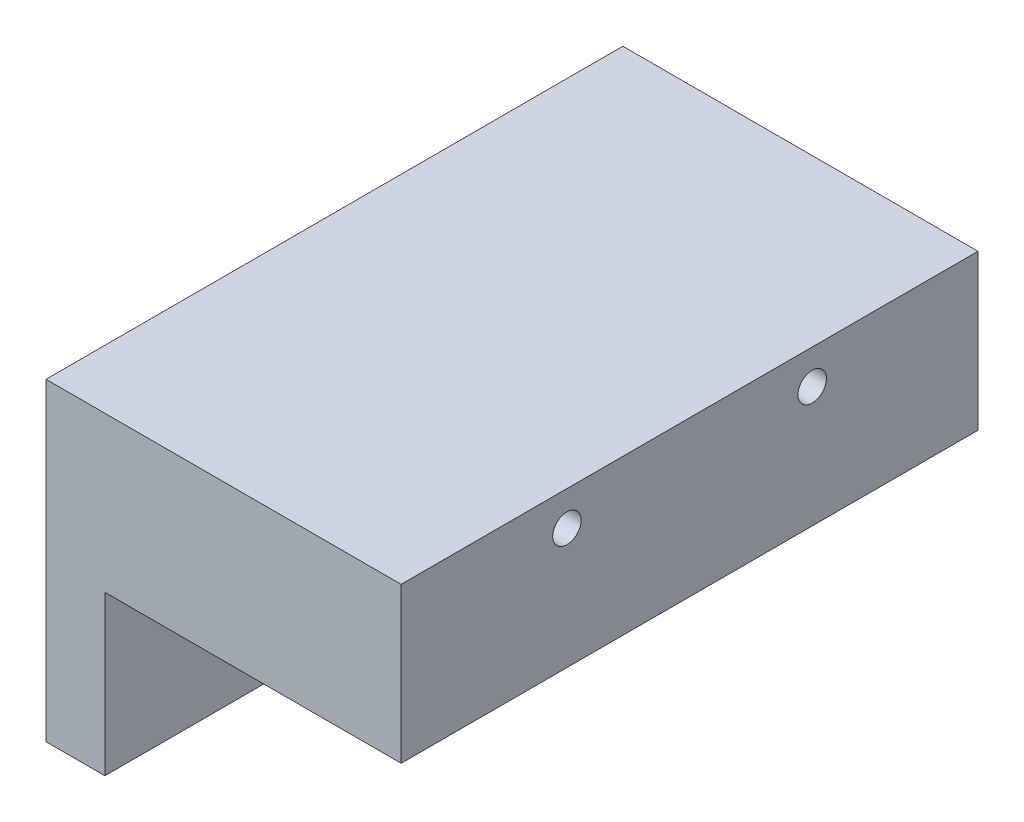
ISO-10303-21;
HEADER;
FILE_DESCRIPTION(('STEP AP214'),'2;1');
FILE_NAME('part.step','',(''),(''),'','','');
FILE_SCHEMA(('AUTOMOTIVE_DESIGN { 1 0 10303 214 1 1 1 1 }'));
ENDSEC;
DATA;
#1=APPLICATION_CONTEXT('core data for automotive mechanical design processes');
#2=APPLICATION_PROTOCOL_DEFINITION('international standard','automotive_design',2000,#1);
#3=PRODUCT_CONTEXT('',#1,'mechanical');
#4=PRODUCT('Part','Part','',(#3));
#5=PRODUCT_RELATED_PRODUCT_CATEGORY('part','',(#4));
#6=PRODUCT_DEFINITION_FORMATION('','',#4);
#7=PRODUCT_DEFINITION_CONTEXT('part definition',#1,'design');
#8=PRODUCT_DEFINITION('design','',#6,#7);
#9=PRODUCT_DEFINITION_SHAPE('','',#8);
#10=(LENGTH_UNIT() NAMED_UNIT(*) SI_UNIT(.MILLI.,.METRE.));
#11=(NAMED_UNIT(*) PLANE_ANGLE_UNIT() SI_UNIT($,.RADIAN.));
#12=(NAMED_UNIT(*) SI_UNIT($,.STERADIAN.) SOLID_ANGLE_UNIT());
#13=UNCERTAINTY_MEASURE_WITH_UNIT(LENGTH_MEASURE(1.E-05),#10,'distance_accuracy_value','');
#14=(GEOMETRIC_REPRESENTATION_CONTEXT(3) GLOBAL_UNCERTAINTY_ASSIGNED_CONTEXT((#13)) GLOBAL_UNIT_ASSIGNED_CONTEXT((#10,
#11,#12)) REPRESENTATION_CONTEXT('',''));
#15=CARTESIAN_POINT('',(0.,0.,0.));
#16=DIRECTION('',(0.,0.,1.));
#17=DIRECTION('',(1.,0.,0.));
#18=AXIS2_PLACEMENT_3D('',#15,#16,#17);
#19=CARTESIAN_POINT('',(-6.,0.,29.4));
#20=DIRECTION('',(0.,0.,-1.));
#21=DIRECTION('',(-1.,0.,0.));
#22=AXIS2_PLACEMENT_3D('',#19,#20,#21);
#23=PLANE('',#22);
#24=DIRECTION('',(0.,1.,0.));
#25=VECTOR('',#24,1.);
#26=CARTESIAN_POINT('',(0.,0.,29.4));
#27=LINE('',#26,#25);
#28=CARTESIAN_POINT('',(0.,-16.,29.4));
#29=VERTEX_POINT('',#28);
#30=CARTESIAN_POINT('',(0.,0.199999999999999,29.4));
#31=VERTEX_POINT('',#30);
#32=EDGE_CURVE('E142',#29,#31,#27,.T.);
#33=ORIENTED_EDGE('',*,*,#32,.T.);
#34=DIRECTION('',(-1.,0.,0.));
#35=VECTOR('',#34,1.);
#36=CARTESIAN_POINT('',(30.2,0.199999999999995,29.4));
#37=LINE('',#36,#35);
#38=CARTESIAN_POINT('',(30.2,0.199999999999995,29.4));
#39=VERTEX_POINT('',#38);
#40=EDGE_CURVE('E139',#39,#31,#37,.T.);
#41=ORIENTED_EDGE('',*,*,#40,.F.);
#42=DIRECTION('',(0.,1.,0.));
#43=VECTOR('',#42,1.);
#44=CARTESIAN_POINT('',(30.2,0.,29.4));
#45=LINE('',#44,#43);
#46=CARTESIAN_POINT('',(30.2,16.,29.4));
#47=VERTEX_POINT('',#46);
#48=EDGE_CURVE('E119',#39,#47,#45,.T.);
#49=ORIENTED_EDGE('',*,*,#48,.T.);
#50=DIRECTION('',(1.,0.,0.));
#51=VECTOR('',#50,1.);
#52=CARTESIAN_POINT('',(-6.,16.,29.4));
#53=LINE('',#52,#51);
#54=CARTESIAN_POINT('',(-6.,16.,29.4));
#55=VERTEX_POINT('',#54);
#56=EDGE_CURVE('E11',#55,#47,#53,.T.);
#57=ORIENTED_EDGE('',*,*,#56,.F.);
#58=DIRECTION('',(0.,1.,0.));
#59=VECTOR('',#58,1.);
#60=CARTESIAN_POINT('',(-6.,0.,29.4));
#61=LINE('',#60,#59);
#62=CARTESIAN_POINT('',(-6.,-16.,29.4));
#63=VERTEX_POINT('',#62);
#64=EDGE_CURVE('E66',#63,#55,#61,.T.);
#65=ORIENTED_EDGE('',*,*,#64,.F.);
#66=DIRECTION('',(1.,0.,0.));
#67=VECTOR('',#66,1.);
#68=CARTESIAN_POINT('',(-6.,-16.,29.4));
#69=LINE('',#68,#67);
#70=EDGE_CURVE('E44',#63,#29,#69,.T.);
#71=ORIENTED_EDGE('',*,*,#70,.T.);
#72=EDGE_LOOP('',(#33,#41,#49,#57,#65,#71));
#73=FACE_BOUND('',#72,.T.);
#74=ADVANCED_FACE('F41',(#73),#23,.F.);
#75=CARTESIAN_POINT('',(-6.,16.,0.));
#76=DIRECTION('',(0.,1.,0.));
#77=DIRECTION('',(0.,0.,1.));
#78=AXIS2_PLACEMENT_3D('',#75,#76,#77);
#79=PLANE('',#78);
#80=ORIENTED_EDGE('',*,*,#56,.T.);
#81=DIRECTION('',(0.,0.,1.));
#82=VECTOR('',#81,1.);
#83=CARTESIAN_POINT('',(30.2,16.,0.));
#84=LINE('',#83,#82);
#85=CARTESIAN_POINT('',(30.2,16.,-29.4));
#86=VERTEX_POINT('',#85);
#87=EDGE_CURVE('E114',#86,#47,#84,.T.);
#88=ORIENTED_EDGE('',*,*,#87,.F.);
#89=DIRECTION('',(1.,0.,0.));
#90=VECTOR('',#89,1.);
#91=CARTESIAN_POINT('',(-6.,16.,-29.4));
#92=LINE('',#91,#90);
#93=CARTESIAN_POINT('',(-6.,16.,-29.4));
#94=VERTEX_POINT('',#93);
#95=EDGE_CURVE('E49',#94,#86,#92,.T.);
#96=ORIENTED_EDGE('',*,*,#95,.F.);
#97=DIRECTION('',(0.,0.,1.));
#98=VECTOR('',#97,1.);
#99=CARTESIAN_POINT('',(-6.,16.,0.));
#100=LINE('',#99,#98);
#101=EDGE_CURVE('E147',#94,#55,#100,.T.);
#102=ORIENTED_EDGE('',*,*,#101,.T.);
#103=EDGE_LOOP('',(#80,#88,#96,#102));
#104=FACE_BOUND('',#103,.T.);
#105=ADVANCED_FACE('F115',(#104),#79,.T.);
#106=CARTESIAN_POINT('',(-6.,0.,-29.4));
#107=DIRECTION('',(0.,0.,-1.));
#108=DIRECTION('',(-1.,0.,0.));
#109=AXIS2_PLACEMENT_3D('',#106,#107,#108);
#110=PLANE('',#109);
#111=DIRECTION('',(0.,1.,0.));
#112=VECTOR('',#111,1.);
#113=CARTESIAN_POINT('',(0.,0.,-29.4));
#114=LINE('',#113,#112);
#115=CARTESIAN_POINT('',(0.,-16.,-29.4));
#116=VERTEX_POINT('',#115);
#117=CARTESIAN_POINT('',(0.,0.200000000000002,-29.4));
#118=VERTEX_POINT('',#117);
#119=EDGE_CURVE('E164',#116,#118,#114,.T.);
#120=ORIENTED_EDGE('',*,*,#119,.F.);
#121=DIRECTION('',(1.,0.,0.));
#122=VECTOR('',#121,1.);
#123=CARTESIAN_POINT('',(-6.,-16.,-29.4));
#124=LINE('',#123,#122);
#125=CARTESIAN_POINT('',(-6.,-16.,-29.4));
#126=VERTEX_POINT('',#125);
#127=EDGE_CURVE('E82',#126,#116,#124,.T.);
#128=ORIENTED_EDGE('',*,*,#127,.F.);
#129=DIRECTION('',(0.,1.,0.));
#130=VECTOR('',#129,1.);
#131=CARTESIAN_POINT('',(-6.,0.,-29.4));
#132=LINE('',#131,#130);
#133=EDGE_CURVE('E109',#126,#94,#132,.T.);
#134=ORIENTED_EDGE('',*,*,#133,.T.);
#135=ORIENTED_EDGE('',*,*,#95,.T.);
#136=DIRECTION('',(0.,1.,0.));
#137=VECTOR('',#136,1.);
#138=CARTESIAN_POINT('',(30.2,0.,-29.4));
#139=LINE('',#138,#137);
#140=CARTESIAN_POINT('',(30.2,0.200000000000002,-29.4));
#141=VERTEX_POINT('',#140);
#142=EDGE_CURVE('E108',#141,#86,#139,.T.);
#143=ORIENTED_EDGE('',*,*,#142,.F.);
#144=DIRECTION('',(-1.,0.,0.));
#145=VECTOR('',#144,1.);
#146=CARTESIAN_POINT('',(30.2,0.200000000000002,-29.4));
#147=LINE('',#146,#145);
#148=EDGE_CURVE('E136',#141,#118,#147,.T.);
#149=ORIENTED_EDGE('',*,*,#148,.T.);
#150=EDGE_LOOP('',(#120,#128,#134,#135,#143,#149));
#151=FACE_BOUND('',#150,.T.);
#152=ADVANCED_FACE('F105',(#151),#110,.T.);
#153=CARTESIAN_POINT('',(-6.,12.5,12.5));
#154=DIRECTION('',(1.,0.,0.));
#155=DIRECTION('',(0.,0.,-1.));
#156=AXIS2_PLACEMENT_3D('',#153,#154,#155);
#157=CYLINDRICAL_SURFACE('',#156,1.45);
#158=CARTESIAN_POINT('',(-6.,12.5,12.5));
#159=DIRECTION('',(1.,0.,0.));
#160=DIRECTION('',(0.,0.,-1.));
#161=AXIS2_PLACEMENT_3D('',#158,#159,#160);
#162=CIRCLE('',#161,1.45);
#163=CARTESIAN_POINT('',(-6.,12.5,11.05));
#164=VERTEX_POINT('',#163);
#165=EDGE_CURVE('E155',#164,#164,#162,.T.);
#166=ORIENTED_EDGE('',*,*,#165,.F.);
#167=EDGE_LOOP('',(#166));
#168=FACE_BOUND('',#167,.T.);
#169=CARTESIAN_POINT('',(30.2,12.5,12.5));
#170=DIRECTION('',(1.,0.,0.));
#171=DIRECTION('',(0.,0.,-1.));
#172=AXIS2_PLACEMENT_3D('',#169,#170,#171);
#173=CIRCLE('',#172,1.45);
#174=CARTESIAN_POINT('',(30.2,12.5,11.05));
#175=VERTEX_POINT('',#174);
#176=EDGE_CURVE('E131',#175,#175,#173,.T.);
#177=ORIENTED_EDGE('',*,*,#176,.T.);
#178=EDGE_LOOP('',(#177));
#179=FACE_BOUND('',#178,.T.);
#180=ADVANCED_FACE('F209',(#168,#179),#157,.F.);
#181=CARTESIAN_POINT('',(-6.,-12.5,-12.5));
#182=DIRECTION('',(1.,0.,0.));
#183=DIRECTION('',(0.,0.,-1.));
#184=AXIS2_PLACEMENT_3D('',#181,#182,#183);
#185=CYLINDRICAL_SURFACE('',#184,1.45);
#186=CARTESIAN_POINT('',(-6.,-12.5,-12.5));
#187=DIRECTION('',(1.,0.,0.));
#188=DIRECTION('',(0.,0.,-1.));
#189=AXIS2_PLACEMENT_3D('',#186,#187,#188);
#190=CIRCLE('',#189,1.45);
#191=CARTESIAN_POINT('',(-6.,-12.5,-13.95));
#192=VERTEX_POINT('',#191);
#193=EDGE_CURVE('E152',#192,#192,#190,.T.);
#194=ORIENTED_EDGE('',*,*,#193,.F.);
#195=EDGE_LOOP('',(#194));
#196=FACE_BOUND('',#195,.T.);
#197=CARTESIAN_POINT('',(0.,-12.5,-12.5));
#198=DIRECTION('',(1.,0.,0.));
#199=DIRECTION('',(0.,0.,-1.));
#200=AXIS2_PLACEMENT_3D('',#197,#198,#199);
#201=CIRCLE('',#200,1.45);
#202=CARTESIAN_POINT('',(0.,-12.5,-13.95));
#203=VERTEX_POINT('',#202);
#204=EDGE_CURVE('E144',#203,#203,#201,.T.);
#205=ORIENTED_EDGE('',*,*,#204,.T.);
#206=EDGE_LOOP('',(#205));
#207=FACE_BOUND('',#206,.T.);
#208=ADVANCED_FACE('F218',(#196,#207),#185,.F.);
#209=CARTESIAN_POINT('',(-6.,-12.5,12.5));
#210=DIRECTION('',(1.,0.,0.));
#211=DIRECTION('',(0.,0.,-1.));
#212=AXIS2_PLACEMENT_3D('',#209,#210,#211);
#213=CYLINDRICAL_SURFACE('',#212,1.45);
#214=CARTESIAN_POINT('',(-6.,-12.5,12.5));
#215=DIRECTION('',(1.,0.,0.));
#216=DIRECTION('',(0.,0.,-1.));
#217=AXIS2_PLACEMENT_3D('',#214,#215,#216);
#218=CIRCLE('',#217,1.45);
#219=CARTESIAN_POINT('',(-6.,-12.5,11.05));
#220=VERTEX_POINT('',#219);
#221=EDGE_CURVE('E149',#220,#220,#218,.T.);
#222=ORIENTED_EDGE('',*,*,#221,.F.);
#223=EDGE_LOOP('',(#222));
#224=FACE_BOUND('',#223,.T.);
#225=CARTESIAN_POINT('',(0.,-12.5,12.5));
#226=DIRECTION('',(1.,0.,0.));
#227=DIRECTION('',(0.,0.,-1.));
#228=AXIS2_PLACEMENT_3D('',#225,#226,#227);
#229=CIRCLE('',#228,1.45);
#230=CARTESIAN_POINT('',(0.,-12.5,11.05));
#231=VERTEX_POINT('',#230);
#232=EDGE_CURVE('E166',#231,#231,#229,.T.);
#233=ORIENTED_EDGE('',*,*,#232,.T.);
#234=EDGE_LOOP('',(#233));
#235=FACE_BOUND('',#234,.T.);
#236=ADVANCED_FACE('F212',(#224,#235),#213,.F.);
#237=CARTESIAN_POINT('',(-6.,-16.,0.));
#238=DIRECTION('',(0.,1.,0.));
#239=DIRECTION('',(0.,0.,1.));
#240=AXIS2_PLACEMENT_3D('',#237,#238,#239);
#241=PLANE('',#240);
#242=DIRECTION('',(0.,0.,1.));
#243=VECTOR('',#242,1.);
#244=CARTESIAN_POINT('',(0.,-16.,0.));
#245=LINE('',#244,#243);
#246=EDGE_CURVE('E162',#116,#29,#245,.T.);
#247=ORIENTED_EDGE('',*,*,#246,.T.);
#248=ORIENTED_EDGE('',*,*,#70,.F.);
#249=DIRECTION('',(0.,0.,1.));
#250=VECTOR('',#249,1.);
#251=CARTESIAN_POINT('',(-6.,-16.,0.));
#252=LINE('',#251,#250);
#253=EDGE_CURVE('E86',#126,#63,#252,.T.);
#254=ORIENTED_EDGE('',*,*,#253,.F.);
#255=ORIENTED_EDGE('',*,*,#127,.T.);
#256=EDGE_LOOP('',(#247,#248,#254,#255));
#257=FACE_BOUND('',#256,.T.);
#258=ADVANCED_FACE('F191',(#257),#241,.F.);
#259=CARTESIAN_POINT('',(-6.,12.5,-12.5));
#260=DIRECTION('',(1.,0.,0.));
#261=DIRECTION('',(0.,0.,-1.));
#262=AXIS2_PLACEMENT_3D('',#259,#260,#261);
#263=CYLINDRICAL_SURFACE('',#262,1.45);
#264=CARTESIAN_POINT('',(-6.,12.5,-12.5));
#265=DIRECTION('',(1.,0.,0.));
#266=DIRECTION('',(0.,0.,-1.));
#267=AXIS2_PLACEMENT_3D('',#264,#265,#266);
#268=CIRCLE('',#267,1.45);
#269=CARTESIAN_POINT('',(-6.,12.5,-13.95));
#270=VERTEX_POINT('',#269);
#271=EDGE_CURVE('E158',#270,#270,#268,.T.);
#272=ORIENTED_EDGE('',*,*,#271,.F.);
#273=EDGE_LOOP('',(#272));
#274=FACE_BOUND('',#273,.T.);
#275=CARTESIAN_POINT('',(30.2,12.5,-12.5));
#276=DIRECTION('',(1.,0.,0.));
#277=DIRECTION('',(0.,0.,-1.));
#278=AXIS2_PLACEMENT_3D('',#275,#276,#277);
#279=CIRCLE('',#278,1.45);
#280=CARTESIAN_POINT('',(30.2,12.5,-13.95));
#281=VERTEX_POINT('',#280);
#282=EDGE_CURVE('E134',#281,#281,#279,.T.);
#283=ORIENTED_EDGE('',*,*,#282,.T.);
#284=EDGE_LOOP('',(#283));
#285=FACE_BOUND('',#284,.T.);
#286=ADVANCED_FACE('F179',(#274,#285),#263,.F.);
#287=CARTESIAN_POINT('',(-6.,0.,0.));
#288=DIRECTION('',(1.,0.,0.));
#289=DIRECTION('',(0.,0.,-1.));
#290=AXIS2_PLACEMENT_3D('',#287,#288,#289);
#291=PLANE('',#290);
#292=ORIENTED_EDGE('',*,*,#64,.T.);
#293=ORIENTED_EDGE('',*,*,#101,.F.);
#294=ORIENTED_EDGE('',*,*,#133,.F.);
#295=ORIENTED_EDGE('',*,*,#253,.T.);
#296=EDGE_LOOP('',(#292,#293,#294,#295));
#297=FACE_BOUND('',#296,.T.);
#298=ORIENTED_EDGE('',*,*,#221,.T.);
#299=EDGE_LOOP('',(#298));
#300=FACE_BOUND('',#299,.T.);
#301=ORIENTED_EDGE('',*,*,#193,.T.);
#302=EDGE_LOOP('',(#301));
#303=FACE_BOUND('',#302,.T.);
#304=ORIENTED_EDGE('',*,*,#165,.T.);
#305=EDGE_LOOP('',(#304));
#306=FACE_BOUND('',#305,.T.);
#307=ORIENTED_EDGE('',*,*,#271,.T.);
#308=EDGE_LOOP('',(#307));
#309=FACE_BOUND('',#308,.T.);
#310=ADVANCED_FACE('F176',(#297,#300,#303,#306,#309),#291,.F.);
#311=CARTESIAN_POINT('',(0.,0.,0.));
#312=DIRECTION('',(1.,0.,0.));
#313=DIRECTION('',(0.,0.,-1.));
#314=AXIS2_PLACEMENT_3D('',#311,#312,#313);
#315=PLANE('',#314);
#316=DIRECTION('',(0.,0.,-1.));
#317=VECTOR('',#316,1.);
#318=CARTESIAN_POINT('',(0.,0.199999999999999,0.));
#319=LINE('',#318,#317);
#320=EDGE_CURVE('E57',#31,#118,#319,.T.);
#321=ORIENTED_EDGE('',*,*,#320,.F.);
#322=ORIENTED_EDGE('',*,*,#32,.F.);
#323=ORIENTED_EDGE('',*,*,#246,.F.);
#324=ORIENTED_EDGE('',*,*,#119,.T.);
#325=EDGE_LOOP('',(#321,#322,#323,#324));
#326=FACE_BOUND('',#325,.T.);
#327=ORIENTED_EDGE('',*,*,#232,.F.);
#328=EDGE_LOOP('',(#327));
#329=FACE_BOUND('',#328,.T.);
#330=ORIENTED_EDGE('',*,*,#204,.F.);
#331=EDGE_LOOP('',(#330));
#332=FACE_BOUND('',#331,.T.);
#333=ADVANCED_FACE('F172',(#326,#329,#332),#315,.T.);
#334=CARTESIAN_POINT('',(30.2,0.199999999999999,0.));
#335=DIRECTION('',(0.,1.,0.));
#336=DIRECTION('',(0.,0.,1.));
#337=AXIS2_PLACEMENT_3D('',#334,#335,#336);
#338=PLANE('',#337);
#339=ORIENTED_EDGE('',*,*,#320,.T.);
#340=ORIENTED_EDGE('',*,*,#148,.F.);
#341=DIRECTION('',(0.,0.,-1.));
#342=VECTOR('',#341,1.);
#343=CARTESIAN_POINT('',(30.2,0.199999999999999,0.));
#344=LINE('',#343,#342);
#345=EDGE_CURVE('E124',#39,#141,#344,.T.);
#346=ORIENTED_EDGE('',*,*,#345,.F.);
#347=ORIENTED_EDGE('',*,*,#40,.T.);
#348=EDGE_LOOP('',(#339,#340,#346,#347));
#349=FACE_BOUND('',#348,.T.);
#350=ADVANCED_FACE('F175',(#349),#338,.F.);
#351=CARTESIAN_POINT('',(30.2,0.,0.));
#352=DIRECTION('',(1.,0.,0.));
#353=DIRECTION('',(0.,0.,-1.));
#354=AXIS2_PLACEMENT_3D('',#351,#352,#353);
#355=PLANE('',#354);
#356=ORIENTED_EDGE('',*,*,#142,.T.);
#357=ORIENTED_EDGE('',*,*,#87,.T.);
#358=ORIENTED_EDGE('',*,*,#48,.F.);
#359=ORIENTED_EDGE('',*,*,#345,.T.);
#360=EDGE_LOOP('',(#356,#357,#358,#359));
#361=FACE_BOUND('',#360,.T.);
#362=ORIENTED_EDGE('',*,*,#176,.F.);
#363=EDGE_LOOP('',(#362));
#364=FACE_BOUND('',#363,.T.);
#365=ORIENTED_EDGE('',*,*,#282,.F.);
#366=EDGE_LOOP('',(#365));
#367=FACE_BOUND('',#366,.T.);
#368=ADVANCED_FACE('F121',(#361,#364,#367),#355,.T.);
#369=CLOSED_SHELL('',(#74,#105,#152,#180,#208,#236,#258,#286,#310,#333,#350,#368));
#370=MANIFOLD_SOLID_BREP('B2',#369);
#371=ADVANCED_BREP_SHAPE_REPRESENTATION('',(#18,#370),#14);
#372=SHAPE_DEFINITION_REPRESENTATION(#9,#371);
ENDSEC;
END-ISO-10303-21;
